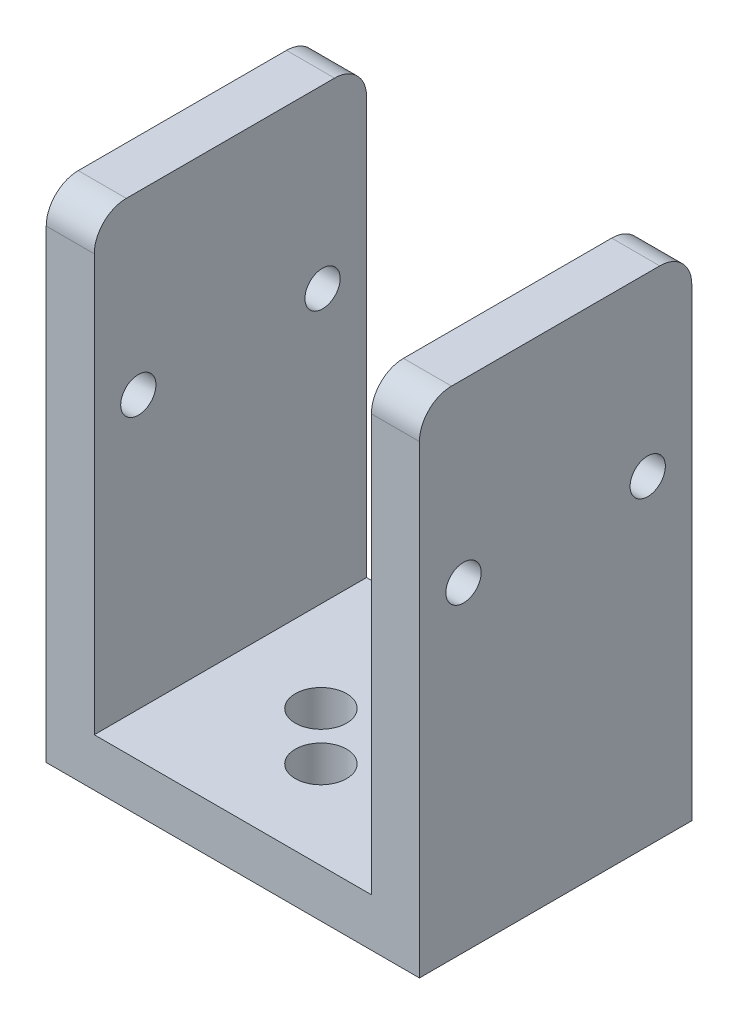
ISO-10303-21;
HEADER;
FILE_DESCRIPTION(('STEP AP214'),'2;1');
FILE_NAME('part.step','',(''),(''),'','','');
FILE_SCHEMA(('AUTOMOTIVE_DESIGN { 1 0 10303 214 1 1 1 1 }'));
ENDSEC;
DATA;
#1=APPLICATION_CONTEXT('core data for automotive mechanical design processes');
#2=APPLICATION_PROTOCOL_DEFINITION('international standard','automotive_design',2000,#1);
#3=PRODUCT_CONTEXT('',#1,'mechanical');
#4=PRODUCT('Part','Part','',(#3));
#5=PRODUCT_RELATED_PRODUCT_CATEGORY('part','',(#4));
#6=PRODUCT_DEFINITION_FORMATION('','',#4);
#7=PRODUCT_DEFINITION_CONTEXT('part definition',#1,'design');
#8=PRODUCT_DEFINITION('design','',#6,#7);
#9=PRODUCT_DEFINITION_SHAPE('','',#8);
#10=(LENGTH_UNIT() NAMED_UNIT(*) SI_UNIT(.MILLI.,.METRE.));
#11=(NAMED_UNIT(*) PLANE_ANGLE_UNIT() SI_UNIT($,.RADIAN.));
#12=(NAMED_UNIT(*) SI_UNIT($,.STERADIAN.) SOLID_ANGLE_UNIT());
#13=UNCERTAINTY_MEASURE_WITH_UNIT(LENGTH_MEASURE(1.E-05),#10,'distance_accuracy_value','');
#14=(GEOMETRIC_REPRESENTATION_CONTEXT(3) GLOBAL_UNCERTAINTY_ASSIGNED_CONTEXT((#13)) GLOBAL_UNIT_ASSIGNED_CONTEXT((#10,
#11,#12)) REPRESENTATION_CONTEXT('',''));
#15=CARTESIAN_POINT('',(0.,0.,0.));
#16=DIRECTION('',(0.,0.,1.));
#17=DIRECTION('',(1.,0.,0.));
#18=AXIS2_PLACEMENT_3D('',#15,#16,#17);
#19=CARTESIAN_POINT('',(0.,3.,0.));
#20=DIRECTION('',(0.,-1.,0.));
#21=DIRECTION('',(0.,0.,-1.));
#22=AXIS2_PLACEMENT_3D('',#19,#20,#21);
#23=PLANE('',#22);
#24=DIRECTION('',(0.,0.,-1.));
#25=VECTOR('',#24,1.);
#26=CARTESIAN_POINT('',(8.65,3.,8.5));
#27=LINE('',#26,#25);
#28=CARTESIAN_POINT('',(8.65,3.,8.5));
#29=VERTEX_POINT('',#28);
#30=CARTESIAN_POINT('',(8.65,3.,-8.5));
#31=VERTEX_POINT('',#30);
#32=EDGE_CURVE('E147',#29,#31,#27,.T.);
#33=ORIENTED_EDGE('',*,*,#32,.T.);
#34=DIRECTION('',(-1.,0.,0.));
#35=VECTOR('',#34,1.);
#36=CARTESIAN_POINT('',(-8.65,3.,-8.5));
#37=LINE('',#36,#35);
#38=CARTESIAN_POINT('',(-8.65,3.,-8.5));
#39=VERTEX_POINT('',#38);
#40=EDGE_CURVE('E209',#31,#39,#37,.T.);
#41=ORIENTED_EDGE('',*,*,#40,.T.);
#42=DIRECTION('',(0.,0.,1.));
#43=VECTOR('',#42,1.);
#44=CARTESIAN_POINT('',(-8.65,3.,8.5));
#45=LINE('',#44,#43);
#46=CARTESIAN_POINT('',(-8.65,3.,8.5));
#47=VERTEX_POINT('',#46);
#48=EDGE_CURVE('E212',#39,#47,#45,.T.);
#49=ORIENTED_EDGE('',*,*,#48,.T.);
#50=DIRECTION('',(1.,0.,0.));
#51=VECTOR('',#50,1.);
#52=CARTESIAN_POINT('',(-8.65,3.,8.5));
#53=LINE('',#52,#51);
#54=EDGE_CURVE('E215',#47,#29,#53,.T.);
#55=ORIENTED_EDGE('',*,*,#54,.T.);
#56=EDGE_LOOP('',(#33,#41,#49,#55));
#57=FACE_BOUND('',#56,.T.);
#58=CARTESIAN_POINT('',(0.,3.,-3.));
#59=DIRECTION('',(0.,1.,0.));
#60=DIRECTION('',(0.,0.,1.));
#61=AXIS2_PLACEMENT_3D('',#58,#59,#60);
#62=CIRCLE('',#61,1.6);
#63=CARTESIAN_POINT('',(0.,3.,-1.4));
#64=VERTEX_POINT('',#63);
#65=EDGE_CURVE('E202',#64,#64,#62,.T.);
#66=ORIENTED_EDGE('',*,*,#65,.F.);
#67=EDGE_LOOP('',(#66));
#68=FACE_BOUND('',#67,.T.);
#69=CARTESIAN_POINT('',(3.,3.,0.));
#70=DIRECTION('',(0.,1.,0.));
#71=DIRECTION('',(0.,0.,1.));
#72=AXIS2_PLACEMENT_3D('',#69,#70,#71);
#73=CIRCLE('',#72,1.6);
#74=CARTESIAN_POINT('',(3.,3.,1.6));
#75=VERTEX_POINT('',#74);
#76=EDGE_CURVE('E196',#75,#75,#73,.T.);
#77=ORIENTED_EDGE('',*,*,#76,.F.);
#78=EDGE_LOOP('',(#77));
#79=FACE_BOUND('',#78,.T.);
#80=CARTESIAN_POINT('',(0.,3.,3.));
#81=DIRECTION('',(0.,1.,0.));
#82=DIRECTION('',(0.,0.,-1.));
#83=AXIS2_PLACEMENT_3D('',#80,#81,#82);
#84=CIRCLE('',#83,1.6);
#85=CARTESIAN_POINT('',(0.,3.,1.4));
#86=VERTEX_POINT('',#85);
#87=EDGE_CURVE('E190',#86,#86,#84,.T.);
#88=ORIENTED_EDGE('',*,*,#87,.F.);
#89=EDGE_LOOP('',(#88));
#90=FACE_BOUND('',#89,.T.);
#91=CARTESIAN_POINT('',(-3.00000000000001,3.,0.));
#92=DIRECTION('',(0.,1.,0.));
#93=DIRECTION('',(0.,0.,-1.));
#94=AXIS2_PLACEMENT_3D('',#91,#92,#93);
#95=CIRCLE('',#94,1.6);
#96=CARTESIAN_POINT('',(-3.00000000000001,3.,-1.6));
#97=VERTEX_POINT('',#96);
#98=EDGE_CURVE('E184',#97,#97,#95,.T.);
#99=ORIENTED_EDGE('',*,*,#98,.F.);
#100=EDGE_LOOP('',(#99));
#101=FACE_BOUND('',#100,.T.);
#102=ADVANCED_FACE('F36',(#57,#68,#79,#90,#101),#23,.F.);
#103=CARTESIAN_POINT('',(0.,0.,0.));
#104=DIRECTION('',(0.,-1.,0.));
#105=DIRECTION('',(0.,0.,-1.));
#106=AXIS2_PLACEMENT_3D('',#103,#104,#105);
#107=PLANE('',#106);
#108=CARTESIAN_POINT('',(0.,0.,3.));
#109=DIRECTION('',(0.,1.,0.));
#110=DIRECTION('',(0.,0.,-1.));
#111=AXIS2_PLACEMENT_3D('',#108,#109,#110);
#112=CIRCLE('',#111,1.6);
#113=CARTESIAN_POINT('',(0.,0.,1.4));
#114=VERTEX_POINT('',#113);
#115=EDGE_CURVE('E187',#114,#114,#112,.T.);
#116=ORIENTED_EDGE('',*,*,#115,.T.);
#117=EDGE_LOOP('',(#116));
#118=FACE_BOUND('',#117,.T.);
#119=CARTESIAN_POINT('',(0.,0.,-3.));
#120=DIRECTION('',(0.,1.,0.));
#121=DIRECTION('',(0.,0.,1.));
#122=AXIS2_PLACEMENT_3D('',#119,#120,#121);
#123=CIRCLE('',#122,1.6);
#124=CARTESIAN_POINT('',(0.,0.,-1.4));
#125=VERTEX_POINT('',#124);
#126=EDGE_CURVE('E199',#125,#125,#123,.T.);
#127=ORIENTED_EDGE('',*,*,#126,.T.);
#128=EDGE_LOOP('',(#127));
#129=FACE_BOUND('',#128,.T.);
#130=DIRECTION('',(-1.,0.,0.));
#131=VECTOR('',#130,1.);
#132=CARTESIAN_POINT('',(-8.65,0.,-8.5));
#133=LINE('',#132,#131);
#134=CARTESIAN_POINT('',(11.65,0.,-8.5));
#135=VERTEX_POINT('',#134);
#136=CARTESIAN_POINT('',(-11.65,0.,-8.5));
#137=VERTEX_POINT('',#136);
#138=EDGE_CURVE('E148',#135,#137,#133,.T.);
#139=ORIENTED_EDGE('',*,*,#138,.F.);
#140=DIRECTION('',(0.,0.,-1.));
#141=VECTOR('',#140,1.);
#142=CARTESIAN_POINT('',(11.65,0.,-8.5));
#143=LINE('',#142,#141);
#144=CARTESIAN_POINT('',(11.65,0.,8.5));
#145=VERTEX_POINT('',#144);
#146=EDGE_CURVE('E132',#145,#135,#143,.T.);
#147=ORIENTED_EDGE('',*,*,#146,.F.);
#148=DIRECTION('',(1.,0.,0.));
#149=VECTOR('',#148,1.);
#150=CARTESIAN_POINT('',(-8.65,0.,8.5));
#151=LINE('',#150,#149);
#152=CARTESIAN_POINT('',(-11.65,0.,8.5));
#153=VERTEX_POINT('',#152);
#154=EDGE_CURVE('E141',#153,#145,#151,.T.);
#155=ORIENTED_EDGE('',*,*,#154,.F.);
#156=DIRECTION('',(0.,0.,1.));
#157=VECTOR('',#156,1.);
#158=CARTESIAN_POINT('',(-11.65,0.,-8.5));
#159=LINE('',#158,#157);
#160=EDGE_CURVE('E169',#137,#153,#159,.T.);
#161=ORIENTED_EDGE('',*,*,#160,.F.);
#162=EDGE_LOOP('',(#139,#147,#155,#161));
#163=FACE_BOUND('',#162,.T.);
#164=CARTESIAN_POINT('',(3.,0.,0.));
#165=DIRECTION('',(0.,1.,0.));
#166=DIRECTION('',(0.,0.,1.));
#167=AXIS2_PLACEMENT_3D('',#164,#165,#166);
#168=CIRCLE('',#167,1.6);
#169=CARTESIAN_POINT('',(3.,0.,1.6));
#170=VERTEX_POINT('',#169);
#171=EDGE_CURVE('E193',#170,#170,#168,.T.);
#172=ORIENTED_EDGE('',*,*,#171,.T.);
#173=EDGE_LOOP('',(#172));
#174=FACE_BOUND('',#173,.T.);
#175=CARTESIAN_POINT('',(-3.00000000000001,0.,0.));
#176=DIRECTION('',(0.,1.,0.));
#177=DIRECTION('',(0.,0.,-1.));
#178=AXIS2_PLACEMENT_3D('',#175,#176,#177);
#179=CIRCLE('',#178,1.6);
#180=CARTESIAN_POINT('',(-3.00000000000001,0.,-1.6));
#181=VERTEX_POINT('',#180);
#182=EDGE_CURVE('E183',#181,#181,#179,.T.);
#183=ORIENTED_EDGE('',*,*,#182,.T.);
#184=EDGE_LOOP('',(#183));
#185=FACE_BOUND('',#184,.T.);
#186=ADVANCED_FACE('F151',(#118,#129,#163,#174,#185),#107,.T.);
#187=CARTESIAN_POINT('',(-8.65,3.,-8.5));
#188=DIRECTION('',(0.,0.,1.));
#189=DIRECTION('',(1.,0.,0.));
#190=AXIS2_PLACEMENT_3D('',#187,#188,#189);
#191=PLANE('',#190);
#192=DIRECTION('',(0.,-1.,0.));
#193=VECTOR('',#192,1.);
#194=CARTESIAN_POINT('',(8.65,31.,-8.5));
#195=LINE('',#194,#193);
#196=CARTESIAN_POINT('',(8.65,29.,-8.5));
#197=VERTEX_POINT('',#196);
#198=EDGE_CURVE('E165',#197,#31,#195,.T.);
#199=ORIENTED_EDGE('',*,*,#198,.F.);
#200=DIRECTION('',(-1.,0.,0.));
#201=VECTOR('',#200,1.);
#202=CARTESIAN_POINT('',(11.65,29.,-8.5));
#203=LINE('',#202,#201);
#204=CARTESIAN_POINT('',(11.65,29.,-8.5));
#205=VERTEX_POINT('',#204);
#206=EDGE_CURVE('E231',#197,#205,#203,.F.);
#207=ORIENTED_EDGE('',*,*,#206,.T.);
#208=DIRECTION('',(0.,-1.,0.));
#209=VECTOR('',#208,1.);
#210=CARTESIAN_POINT('',(11.65,31.,-8.5));
#211=LINE('',#210,#209);
#212=EDGE_CURVE('E138',#205,#135,#211,.T.);
#213=ORIENTED_EDGE('',*,*,#212,.T.);
#214=ORIENTED_EDGE('',*,*,#138,.T.);
#215=DIRECTION('',(0.,-1.,0.));
#216=VECTOR('',#215,1.);
#217=CARTESIAN_POINT('',(-11.65,31.,-8.5));
#218=LINE('',#217,#216);
#219=CARTESIAN_POINT('',(-11.65,29.,-8.5));
#220=VERTEX_POINT('',#219);
#221=EDGE_CURVE('E179',#220,#137,#218,.T.);
#222=ORIENTED_EDGE('',*,*,#221,.F.);
#223=DIRECTION('',(-1.,0.,0.));
#224=VECTOR('',#223,1.);
#225=CARTESIAN_POINT('',(-8.65,29.,-8.5));
#226=LINE('',#225,#224);
#227=CARTESIAN_POINT('',(-8.65,29.,-8.5));
#228=VERTEX_POINT('',#227);
#229=EDGE_CURVE('E229',#220,#228,#226,.F.);
#230=ORIENTED_EDGE('',*,*,#229,.T.);
#231=DIRECTION('',(0.,-1.,0.));
#232=VECTOR('',#231,1.);
#233=CARTESIAN_POINT('',(-8.65,31.,-8.5));
#234=LINE('',#233,#232);
#235=EDGE_CURVE('E181',#228,#39,#234,.T.);
#236=ORIENTED_EDGE('',*,*,#235,.T.);
#237=ORIENTED_EDGE('',*,*,#40,.F.);
#238=EDGE_LOOP('',(#199,#207,#213,#214,#222,#230,#236,#237));
#239=FACE_BOUND('',#238,.T.);
#240=ADVANCED_FACE('F296',(#239),#191,.F.);
#241=CARTESIAN_POINT('',(-8.65,3.,8.5));
#242=DIRECTION('',(0.,0.,-1.));
#243=DIRECTION('',(-1.,0.,0.));
#244=AXIS2_PLACEMENT_3D('',#241,#242,#243);
#245=PLANE('',#244);
#246=DIRECTION('',(0.,-1.,0.));
#247=VECTOR('',#246,1.);
#248=CARTESIAN_POINT('',(11.65,31.,8.5));
#249=LINE('',#248,#247);
#250=CARTESIAN_POINT('',(11.65,29.,8.5));
#251=VERTEX_POINT('',#250);
#252=EDGE_CURVE('E127',#251,#145,#249,.T.);
#253=ORIENTED_EDGE('',*,*,#252,.F.);
#254=DIRECTION('',(1.,0.,0.));
#255=VECTOR('',#254,1.);
#256=CARTESIAN_POINT('',(8.65,29.,8.5));
#257=LINE('',#256,#255);
#258=CARTESIAN_POINT('',(8.65,29.,8.5));
#259=VERTEX_POINT('',#258);
#260=EDGE_CURVE('E238',#251,#259,#257,.F.);
#261=ORIENTED_EDGE('',*,*,#260,.T.);
#262=DIRECTION('',(0.,-1.,0.));
#263=VECTOR('',#262,1.);
#264=CARTESIAN_POINT('',(8.65,31.,8.5));
#265=LINE('',#264,#263);
#266=EDGE_CURVE('E137',#259,#29,#265,.T.);
#267=ORIENTED_EDGE('',*,*,#266,.T.);
#268=ORIENTED_EDGE('',*,*,#54,.F.);
#269=DIRECTION('',(0.,-1.,0.));
#270=VECTOR('',#269,1.);
#271=CARTESIAN_POINT('',(-8.65,31.,8.5));
#272=LINE('',#271,#270);
#273=CARTESIAN_POINT('',(-8.65,29.,8.5));
#274=VERTEX_POINT('',#273);
#275=EDGE_CURVE('E175',#274,#47,#272,.T.);
#276=ORIENTED_EDGE('',*,*,#275,.F.);
#277=DIRECTION('',(1.,0.,0.));
#278=VECTOR('',#277,1.);
#279=CARTESIAN_POINT('',(-8.65,29.,8.5));
#280=LINE('',#279,#278);
#281=CARTESIAN_POINT('',(-11.65,29.,8.5));
#282=VERTEX_POINT('',#281);
#283=EDGE_CURVE('E236',#274,#282,#280,.F.);
#284=ORIENTED_EDGE('',*,*,#283,.T.);
#285=DIRECTION('',(0.,-1.,0.));
#286=VECTOR('',#285,1.);
#287=CARTESIAN_POINT('',(-11.65,31.,8.5));
#288=LINE('',#287,#286);
#289=EDGE_CURVE('E143',#282,#153,#288,.T.);
#290=ORIENTED_EDGE('',*,*,#289,.T.);
#291=ORIENTED_EDGE('',*,*,#154,.T.);
#292=EDGE_LOOP('',(#253,#261,#267,#268,#276,#284,#290,#291));
#293=FACE_BOUND('',#292,.T.);
#294=ADVANCED_FACE('F142',(#293),#245,.F.);
#295=CARTESIAN_POINT('',(0.,3.,-3.));
#296=DIRECTION('',(0.,-1.,0.));
#297=DIRECTION('',(0.,0.,-1.));
#298=AXIS2_PLACEMENT_3D('',#295,#296,#297);
#299=CYLINDRICAL_SURFACE('',#298,1.6);
#300=ORIENTED_EDGE('',*,*,#65,.T.);
#301=EDGE_LOOP('',(#300));
#302=FACE_BOUND('',#301,.T.);
#303=ORIENTED_EDGE('',*,*,#126,.F.);
#304=EDGE_LOOP('',(#303));
#305=FACE_BOUND('',#304,.T.);
#306=ADVANCED_FACE('F301',(#302,#305),#299,.F.);
#307=CARTESIAN_POINT('',(3.,3.,0.));
#308=DIRECTION('',(0.,-1.,0.));
#309=DIRECTION('',(0.,0.,-1.));
#310=AXIS2_PLACEMENT_3D('',#307,#308,#309);
#311=CYLINDRICAL_SURFACE('',#310,1.6);
#312=ORIENTED_EDGE('',*,*,#76,.T.);
#313=EDGE_LOOP('',(#312));
#314=FACE_BOUND('',#313,.T.);
#315=ORIENTED_EDGE('',*,*,#171,.F.);
#316=EDGE_LOOP('',(#315));
#317=FACE_BOUND('',#316,.T.);
#318=ADVANCED_FACE('F374',(#314,#317),#311,.F.);
#319=CARTESIAN_POINT('',(0.,3.,3.));
#320=DIRECTION('',(0.,-1.,0.));
#321=DIRECTION('',(0.,0.,-1.));
#322=AXIS2_PLACEMENT_3D('',#319,#320,#321);
#323=CYLINDRICAL_SURFACE('',#322,1.6);
#324=ORIENTED_EDGE('',*,*,#87,.T.);
#325=EDGE_LOOP('',(#324));
#326=FACE_BOUND('',#325,.T.);
#327=ORIENTED_EDGE('',*,*,#115,.F.);
#328=EDGE_LOOP('',(#327));
#329=FACE_BOUND('',#328,.T.);
#330=ADVANCED_FACE('F371',(#326,#329),#323,.F.);
#331=CARTESIAN_POINT('',(-3.00000000000001,3.,0.));
#332=DIRECTION('',(0.,-1.,0.));
#333=DIRECTION('',(0.,0.,-1.));
#334=AXIS2_PLACEMENT_3D('',#331,#332,#333);
#335=CYLINDRICAL_SURFACE('',#334,1.6);
#336=ORIENTED_EDGE('',*,*,#98,.T.);
#337=EDGE_LOOP('',(#336));
#338=FACE_BOUND('',#337,.T.);
#339=ORIENTED_EDGE('',*,*,#182,.F.);
#340=EDGE_LOOP('',(#339));
#341=FACE_BOUND('',#340,.T.);
#342=ADVANCED_FACE('F367',(#338,#341),#335,.F.);
#343=CARTESIAN_POINT('',(-8.65,31.,-8.5));
#344=DIRECTION('',(-1.,0.,0.));
#345=DIRECTION('',(0.,0.,1.));
#346=AXIS2_PLACEMENT_3D('',#343,#344,#345);
#347=PLANE('',#346);
#348=CARTESIAN_POINT('',(-8.65,20.,5.75));
#349=DIRECTION('',(-1.,0.,0.));
#350=DIRECTION('',(0.,0.,1.));
#351=AXIS2_PLACEMENT_3D('',#348,#349,#350);
#352=CIRCLE('',#351,1.1);
#353=CARTESIAN_POINT('',(-8.65,20.,6.85));
#354=VERTEX_POINT('',#353);
#355=EDGE_CURVE('E155',#354,#354,#352,.T.);
#356=ORIENTED_EDGE('',*,*,#355,.T.);
#357=EDGE_LOOP('',(#356));
#358=FACE_BOUND('',#357,.T.);
#359=CARTESIAN_POINT('',(-8.65,20.,-5.75));
#360=DIRECTION('',(-1.,0.,0.));
#361=DIRECTION('',(0.,0.,1.));
#362=AXIS2_PLACEMENT_3D('',#359,#360,#361);
#363=CIRCLE('',#362,1.1);
#364=CARTESIAN_POINT('',(-8.65,20.,-4.65));
#365=VERTEX_POINT('',#364);
#366=EDGE_CURVE('E256',#365,#365,#363,.T.);
#367=ORIENTED_EDGE('',*,*,#366,.T.);
#368=EDGE_LOOP('',(#367));
#369=FACE_BOUND('',#368,.T.);
#370=DIRECTION('',(0.,0.,-1.));
#371=VECTOR('',#370,1.);
#372=CARTESIAN_POINT('',(-8.65,31.,-8.5));
#373=LINE('',#372,#371);
#374=CARTESIAN_POINT('',(-8.65,31.,6.5));
#375=VERTEX_POINT('',#374);
#376=CARTESIAN_POINT('',(-8.65,31.,-6.5));
#377=VERTEX_POINT('',#376);
#378=EDGE_CURVE('E170',#375,#377,#373,.T.);
#379=ORIENTED_EDGE('',*,*,#378,.F.);
#380=CARTESIAN_POINT('',(-8.65,29.,6.5));
#381=DIRECTION('',(-1.,0.,0.));
#382=DIRECTION('',(0.,0.,1.));
#383=AXIS2_PLACEMENT_3D('',#380,#381,#382);
#384=CIRCLE('',#383,2.);
#385=EDGE_CURVE('E247',#375,#274,#384,.F.);
#386=ORIENTED_EDGE('',*,*,#385,.T.);
#387=ORIENTED_EDGE('',*,*,#275,.T.);
#388=ORIENTED_EDGE('',*,*,#48,.F.);
#389=ORIENTED_EDGE('',*,*,#235,.F.);
#390=CARTESIAN_POINT('',(-8.65,29.,-6.5));
#391=DIRECTION('',(-1.,0.,0.));
#392=DIRECTION('',(0.,0.,1.));
#393=AXIS2_PLACEMENT_3D('',#390,#391,#392);
#394=CIRCLE('',#393,2.);
#395=EDGE_CURVE('E245',#228,#377,#394,.F.);
#396=ORIENTED_EDGE('',*,*,#395,.T.);
#397=EDGE_LOOP('',(#379,#386,#387,#388,#389,#396));
#398=FACE_BOUND('',#397,.T.);
#399=ADVANCED_FACE('F329',(#358,#369,#398),#347,.F.);
#400=CARTESIAN_POINT('',(-11.65,31.,-8.5));
#401=DIRECTION('',(1.,0.,0.));
#402=DIRECTION('',(0.,0.,-1.));
#403=AXIS2_PLACEMENT_3D('',#400,#401,#402);
#404=PLANE('',#403);
#405=CARTESIAN_POINT('',(-11.65,20.,5.75));
#406=DIRECTION('',(-1.,0.,0.));
#407=DIRECTION('',(0.,0.,1.));
#408=AXIS2_PLACEMENT_3D('',#405,#406,#407);
#409=CIRCLE('',#408,1.1);
#410=CARTESIAN_POINT('',(-11.65,20.,6.85));
#411=VERTEX_POINT('',#410);
#412=EDGE_CURVE('E252',#411,#411,#409,.T.);
#413=ORIENTED_EDGE('',*,*,#412,.F.);
#414=EDGE_LOOP('',(#413));
#415=FACE_BOUND('',#414,.T.);
#416=CARTESIAN_POINT('',(-11.65,20.,-5.75));
#417=DIRECTION('',(-1.,0.,0.));
#418=DIRECTION('',(0.,0.,-1.));
#419=AXIS2_PLACEMENT_3D('',#416,#417,#418);
#420=CIRCLE('',#419,1.1);
#421=CARTESIAN_POINT('',(-11.65,20.,-6.85));
#422=VERTEX_POINT('',#421);
#423=EDGE_CURVE('E259',#422,#422,#420,.T.);
#424=ORIENTED_EDGE('',*,*,#423,.F.);
#425=EDGE_LOOP('',(#424));
#426=FACE_BOUND('',#425,.T.);
#427=ORIENTED_EDGE('',*,*,#289,.F.);
#428=CARTESIAN_POINT('',(-11.65,29.,6.5));
#429=DIRECTION('',(1.,0.,0.));
#430=DIRECTION('',(0.,0.,-1.));
#431=AXIS2_PLACEMENT_3D('',#428,#429,#430);
#432=CIRCLE('',#431,2.);
#433=CARTESIAN_POINT('',(-11.65,31.,6.5));
#434=VERTEX_POINT('',#433);
#435=EDGE_CURVE('E11',#282,#434,#432,.F.);
#436=ORIENTED_EDGE('',*,*,#435,.T.);
#437=DIRECTION('',(0.,0.,1.));
#438=VECTOR('',#437,1.);
#439=CARTESIAN_POINT('',(-11.65,31.,-8.5));
#440=LINE('',#439,#438);
#441=CARTESIAN_POINT('',(-11.65,31.,-6.5));
#442=VERTEX_POINT('',#441);
#443=EDGE_CURVE('E173',#442,#434,#440,.T.);
#444=ORIENTED_EDGE('',*,*,#443,.F.);
#445=CARTESIAN_POINT('',(-11.65,29.,-6.5));
#446=DIRECTION('',(1.,0.,0.));
#447=DIRECTION('',(0.,0.,-1.));
#448=AXIS2_PLACEMENT_3D('',#445,#446,#447);
#449=CIRCLE('',#448,2.);
#450=EDGE_CURVE('E45',#442,#220,#449,.F.);
#451=ORIENTED_EDGE('',*,*,#450,.T.);
#452=ORIENTED_EDGE('',*,*,#221,.T.);
#453=ORIENTED_EDGE('',*,*,#160,.T.);
#454=EDGE_LOOP('',(#427,#436,#444,#451,#452,#453));
#455=FACE_BOUND('',#454,.T.);
#456=ADVANCED_FACE('F334',(#415,#426,#455),#404,.F.);
#457=CARTESIAN_POINT('',(0.,31.,0.));
#458=DIRECTION('',(0.,-1.,0.));
#459=DIRECTION('',(0.,0.,-1.));
#460=AXIS2_PLACEMENT_3D('',#457,#458,#459);
#461=PLANE('',#460);
#462=ORIENTED_EDGE('',*,*,#443,.T.);
#463=DIRECTION('',(1.,0.,0.));
#464=VECTOR('',#463,1.);
#465=CARTESIAN_POINT('',(0.,31.,6.5));
#466=LINE('',#465,#464);
#467=EDGE_CURVE('E242',#434,#375,#466,.T.);
#468=ORIENTED_EDGE('',*,*,#467,.T.);
#469=ORIENTED_EDGE('',*,*,#378,.T.);
#470=DIRECTION('',(-1.,0.,0.));
#471=VECTOR('',#470,1.);
#472=CARTESIAN_POINT('',(0.,31.,-6.5));
#473=LINE('',#472,#471);
#474=EDGE_CURVE('E240',#377,#442,#473,.T.);
#475=ORIENTED_EDGE('',*,*,#474,.T.);
#476=EDGE_LOOP('',(#462,#468,#469,#475));
#477=FACE_BOUND('',#476,.T.);
#478=ADVANCED_FACE('F327',(#477),#461,.F.);
#479=CARTESIAN_POINT('',(8.65,31.,-8.5));
#480=DIRECTION('',(1.,0.,0.));
#481=DIRECTION('',(0.,0.,-1.));
#482=AXIS2_PLACEMENT_3D('',#479,#480,#481);
#483=PLANE('',#482);
#484=CARTESIAN_POINT('',(8.65,20.,5.75));
#485=DIRECTION('',(1.,0.,0.));
#486=DIRECTION('',(0.,0.,-1.));
#487=AXIS2_PLACEMENT_3D('',#484,#485,#486);
#488=CIRCLE('',#487,1.1);
#489=CARTESIAN_POINT('',(8.65,20.,4.65));
#490=VERTEX_POINT('',#489);
#491=EDGE_CURVE('E161',#490,#490,#488,.T.);
#492=ORIENTED_EDGE('',*,*,#491,.T.);
#493=EDGE_LOOP('',(#492));
#494=FACE_BOUND('',#493,.T.);
#495=CARTESIAN_POINT('',(8.65,20.,-5.75));
#496=DIRECTION('',(1.,0.,0.));
#497=DIRECTION('',(0.,0.,-1.));
#498=AXIS2_PLACEMENT_3D('',#495,#496,#497);
#499=CIRCLE('',#498,1.1);
#500=CARTESIAN_POINT('',(8.65,20.,-6.85));
#501=VERTEX_POINT('',#500);
#502=EDGE_CURVE('E251',#501,#501,#499,.T.);
#503=ORIENTED_EDGE('',*,*,#502,.T.);
#504=EDGE_LOOP('',(#503));
#505=FACE_BOUND('',#504,.T.);
#506=DIRECTION('',(0.,0.,1.));
#507=VECTOR('',#506,1.);
#508=CARTESIAN_POINT('',(8.65,31.,-8.5));
#509=LINE('',#508,#507);
#510=CARTESIAN_POINT('',(8.65,31.,-6.5));
#511=VERTEX_POINT('',#510);
#512=CARTESIAN_POINT('',(8.65,31.,6.5));
#513=VERTEX_POINT('',#512);
#514=EDGE_CURVE('E154',#511,#513,#509,.T.);
#515=ORIENTED_EDGE('',*,*,#514,.F.);
#516=CARTESIAN_POINT('',(8.65,29.,-6.5));
#517=DIRECTION('',(1.,0.,0.));
#518=DIRECTION('',(0.,0.,-1.));
#519=AXIS2_PLACEMENT_3D('',#516,#517,#518);
#520=CIRCLE('',#519,2.);
#521=EDGE_CURVE('E227',#511,#197,#520,.F.);
#522=ORIENTED_EDGE('',*,*,#521,.T.);
#523=ORIENTED_EDGE('',*,*,#198,.T.);
#524=ORIENTED_EDGE('',*,*,#32,.F.);
#525=ORIENTED_EDGE('',*,*,#266,.F.);
#526=CARTESIAN_POINT('',(8.65,29.,6.5));
#527=DIRECTION('',(1.,0.,0.));
#528=DIRECTION('',(0.,0.,-1.));
#529=AXIS2_PLACEMENT_3D('',#526,#527,#528);
#530=CIRCLE('',#529,2.);
#531=EDGE_CURVE('E225',#259,#513,#530,.F.);
#532=ORIENTED_EDGE('',*,*,#531,.T.);
#533=EDGE_LOOP('',(#515,#522,#523,#524,#525,#532));
#534=FACE_BOUND('',#533,.T.);
#535=ADVANCED_FACE('F345',(#494,#505,#534),#483,.F.);
#536=CARTESIAN_POINT('',(11.65,31.,-8.5));
#537=DIRECTION('',(-1.,0.,0.));
#538=DIRECTION('',(0.,0.,1.));
#539=AXIS2_PLACEMENT_3D('',#536,#537,#538);
#540=PLANE('',#539);
#541=CARTESIAN_POINT('',(11.65,20.,5.75));
#542=DIRECTION('',(-1.,0.,0.));
#543=DIRECTION('',(0.,0.,1.));
#544=AXIS2_PLACEMENT_3D('',#541,#542,#543);
#545=CIRCLE('',#544,1.1);
#546=CARTESIAN_POINT('',(11.65,20.,6.85));
#547=VERTEX_POINT('',#546);
#548=EDGE_CURVE('E40',#547,#547,#545,.T.);
#549=ORIENTED_EDGE('',*,*,#548,.T.);
#550=EDGE_LOOP('',(#549));
#551=FACE_BOUND('',#550,.T.);
#552=CARTESIAN_POINT('',(11.65,20.,-5.75));
#553=DIRECTION('',(-1.,0.,0.));
#554=DIRECTION('',(0.,0.,1.));
#555=AXIS2_PLACEMENT_3D('',#552,#553,#554);
#556=CIRCLE('',#555,1.1);
#557=CARTESIAN_POINT('',(11.65,20.,-4.65));
#558=VERTEX_POINT('',#557);
#559=EDGE_CURVE('E249',#558,#558,#556,.T.);
#560=ORIENTED_EDGE('',*,*,#559,.T.);
#561=EDGE_LOOP('',(#560));
#562=FACE_BOUND('',#561,.T.);
#563=ORIENTED_EDGE('',*,*,#212,.F.);
#564=CARTESIAN_POINT('',(11.65,29.,-6.5));
#565=DIRECTION('',(-1.,0.,0.));
#566=DIRECTION('',(0.,0.,1.));
#567=AXIS2_PLACEMENT_3D('',#564,#565,#566);
#568=CIRCLE('',#567,2.);
#569=CARTESIAN_POINT('',(11.65,31.,-6.5));
#570=VERTEX_POINT('',#569);
#571=EDGE_CURVE('E234',#205,#570,#568,.F.);
#572=ORIENTED_EDGE('',*,*,#571,.T.);
#573=DIRECTION('',(0.,0.,-1.));
#574=VECTOR('',#573,1.);
#575=CARTESIAN_POINT('',(11.65,31.,-8.5));
#576=LINE('',#575,#574);
#577=CARTESIAN_POINT('',(11.65,31.,6.5));
#578=VERTEX_POINT('',#577);
#579=EDGE_CURVE('E158',#578,#570,#576,.T.);
#580=ORIENTED_EDGE('',*,*,#579,.F.);
#581=CARTESIAN_POINT('',(11.65,29.,6.5));
#582=DIRECTION('',(-1.,0.,0.));
#583=DIRECTION('',(0.,0.,1.));
#584=AXIS2_PLACEMENT_3D('',#581,#582,#583);
#585=CIRCLE('',#584,2.);
#586=EDGE_CURVE('E134',#578,#251,#585,.F.);
#587=ORIENTED_EDGE('',*,*,#586,.T.);
#588=ORIENTED_EDGE('',*,*,#252,.T.);
#589=ORIENTED_EDGE('',*,*,#146,.T.);
#590=EDGE_LOOP('',(#563,#572,#580,#587,#588,#589));
#591=FACE_BOUND('',#590,.T.);
#592=ADVANCED_FACE('F130',(#551,#562,#591),#540,.F.);
#593=CARTESIAN_POINT('',(0.,31.,0.));
#594=DIRECTION('',(0.,1.,0.));
#595=DIRECTION('',(0.,0.,1.));
#596=AXIS2_PLACEMENT_3D('',#593,#594,#595);
#597=PLANE('',#596);
#598=ORIENTED_EDGE('',*,*,#579,.T.);
#599=DIRECTION('',(-1.,0.,0.));
#600=VECTOR('',#599,1.);
#601=CARTESIAN_POINT('',(8.65,31.,-6.5));
#602=LINE('',#601,#600);
#603=EDGE_CURVE('E222',#570,#511,#602,.T.);
#604=ORIENTED_EDGE('',*,*,#603,.T.);
#605=ORIENTED_EDGE('',*,*,#514,.T.);
#606=DIRECTION('',(1.,0.,0.));
#607=VECTOR('',#606,1.);
#608=CARTESIAN_POINT('',(11.65,31.,6.5));
#609=LINE('',#608,#607);
#610=EDGE_CURVE('E218',#513,#578,#609,.T.);
#611=ORIENTED_EDGE('',*,*,#610,.T.);
#612=EDGE_LOOP('',(#598,#604,#605,#611));
#613=FACE_BOUND('',#612,.T.);
#614=ADVANCED_FACE('F313',(#613),#597,.T.);
#615=CARTESIAN_POINT('',(0.,29.,-6.5));
#616=DIRECTION('',(1.,0.,0.));
#617=DIRECTION('',(0.,0.,-1.));
#618=AXIS2_PLACEMENT_3D('',#615,#616,#617);
#619=CYLINDRICAL_SURFACE('',#618,2.);
#620=ORIENTED_EDGE('',*,*,#571,.F.);
#621=ORIENTED_EDGE('',*,*,#206,.F.);
#622=ORIENTED_EDGE('',*,*,#521,.F.);
#623=ORIENTED_EDGE('',*,*,#603,.F.);
#624=EDGE_LOOP('',(#620,#621,#622,#623));
#625=FACE_BOUND('',#624,.T.);
#626=ADVANCED_FACE('F309',(#625),#619,.T.);
#627=CARTESIAN_POINT('',(0.,29.,6.5));
#628=DIRECTION('',(-1.,0.,0.));
#629=DIRECTION('',(0.,0.,1.));
#630=AXIS2_PLACEMENT_3D('',#627,#628,#629);
#631=CYLINDRICAL_SURFACE('',#630,2.);
#632=ORIENTED_EDGE('',*,*,#531,.F.);
#633=ORIENTED_EDGE('',*,*,#260,.F.);
#634=ORIENTED_EDGE('',*,*,#586,.F.);
#635=ORIENTED_EDGE('',*,*,#610,.F.);
#636=EDGE_LOOP('',(#632,#633,#634,#635));
#637=FACE_BOUND('',#636,.T.);
#638=ADVANCED_FACE('F312',(#637),#631,.T.);
#639=CARTESIAN_POINT('',(0.,29.,6.5));
#640=DIRECTION('',(1.,0.,0.));
#641=DIRECTION('',(0.,0.,-1.));
#642=AXIS2_PLACEMENT_3D('',#639,#640,#641);
#643=CYLINDRICAL_SURFACE('',#642,2.);
#644=ORIENTED_EDGE('',*,*,#435,.F.);
#645=ORIENTED_EDGE('',*,*,#283,.F.);
#646=ORIENTED_EDGE('',*,*,#385,.F.);
#647=ORIENTED_EDGE('',*,*,#467,.F.);
#648=EDGE_LOOP('',(#644,#645,#646,#647));
#649=FACE_BOUND('',#648,.T.);
#650=ADVANCED_FACE('F316',(#649),#643,.T.);
#651=CARTESIAN_POINT('',(0.,29.,-6.5));
#652=DIRECTION('',(-1.,0.,0.));
#653=DIRECTION('',(0.,0.,1.));
#654=AXIS2_PLACEMENT_3D('',#651,#652,#653);
#655=CYLINDRICAL_SURFACE('',#654,2.);
#656=ORIENTED_EDGE('',*,*,#395,.F.);
#657=ORIENTED_EDGE('',*,*,#229,.F.);
#658=ORIENTED_EDGE('',*,*,#450,.F.);
#659=ORIENTED_EDGE('',*,*,#474,.F.);
#660=EDGE_LOOP('',(#656,#657,#658,#659));
#661=FACE_BOUND('',#660,.T.);
#662=ADVANCED_FACE('F38',(#661),#655,.T.);
#663=CARTESIAN_POINT('',(16.35,20.,-5.75));
#664=DIRECTION('',(-1.,0.,0.));
#665=DIRECTION('',(0.,0.,1.));
#666=AXIS2_PLACEMENT_3D('',#663,#664,#665);
#667=CYLINDRICAL_SURFACE('',#666,1.1);
#668=ORIENTED_EDGE('',*,*,#559,.F.);
#669=EDGE_LOOP('',(#668));
#670=FACE_BOUND('',#669,.T.);
#671=ORIENTED_EDGE('',*,*,#502,.F.);
#672=EDGE_LOOP('',(#671));
#673=FACE_BOUND('',#672,.T.);
#674=ADVANCED_FACE('F279',(#670,#673),#667,.F.);
#675=CARTESIAN_POINT('',(16.35,20.,5.75));
#676=DIRECTION('',(-1.,0.,0.));
#677=DIRECTION('',(0.,0.,1.));
#678=AXIS2_PLACEMENT_3D('',#675,#676,#677);
#679=CYLINDRICAL_SURFACE('',#678,1.1);
#680=ORIENTED_EDGE('',*,*,#548,.F.);
#681=EDGE_LOOP('',(#680));
#682=FACE_BOUND('',#681,.T.);
#683=ORIENTED_EDGE('',*,*,#491,.F.);
#684=EDGE_LOOP('',(#683));
#685=FACE_BOUND('',#684,.T.);
#686=ADVANCED_FACE('F275',(#682,#685),#679,.F.);
#687=ORIENTED_EDGE('',*,*,#423,.T.);
#688=EDGE_LOOP('',(#687));
#689=FACE_BOUND('',#688,.T.);
#690=ORIENTED_EDGE('',*,*,#366,.F.);
#691=EDGE_LOOP('',(#690));
#692=FACE_BOUND('',#691,.T.);
#693=ADVANCED_FACE('F278',(#689,#692),#667,.F.);
#694=ORIENTED_EDGE('',*,*,#412,.T.);
#695=EDGE_LOOP('',(#694));
#696=FACE_BOUND('',#695,.T.);
#697=ORIENTED_EDGE('',*,*,#355,.F.);
#698=EDGE_LOOP('',(#697));
#699=FACE_BOUND('',#698,.T.);
#700=ADVANCED_FACE('F281',(#696,#699),#679,.F.);
#701=CLOSED_SHELL('',(#102,#186,#240,#294,#306,#318,#330,#342,#399,#456,#478,#535,#592,#614,
#626,#638,#650,#662,#674,#686,#693,#700));
#702=MANIFOLD_SOLID_BREP('B2',#701);
#703=ADVANCED_BREP_SHAPE_REPRESENTATION('',(#18,#702),#14);
#704=SHAPE_DEFINITION_REPRESENTATION(#9,#703);
ENDSEC;
END-ISO-10303-21;
